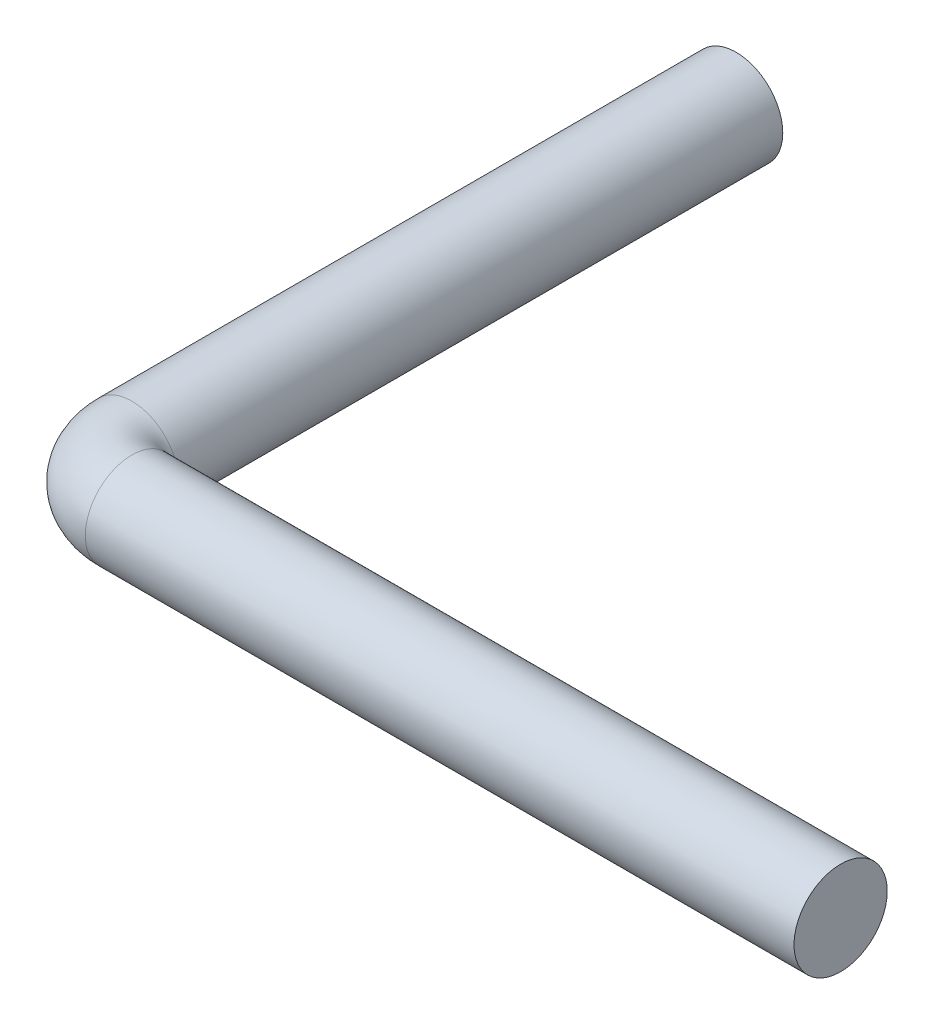
ISO-10303-21;
HEADER;
FILE_DESCRIPTION(('STEP AP214'),'2;1');
FILE_NAME('part.step','',(''),(''),'','','');
FILE_SCHEMA(('AUTOMOTIVE_DESIGN { 1 0 10303 214 1 1 1 1 }'));
ENDSEC;
DATA;
#1=APPLICATION_CONTEXT('core data for automotive mechanical design processes');
#2=APPLICATION_PROTOCOL_DEFINITION('international standard','automotive_design',2000,#1);
#3=PRODUCT_CONTEXT('',#1,'mechanical');
#4=PRODUCT('Part','Part','',(#3));
#5=PRODUCT_RELATED_PRODUCT_CATEGORY('part','',(#4));
#6=PRODUCT_DEFINITION_FORMATION('','',#4);
#7=PRODUCT_DEFINITION_CONTEXT('part definition',#1,'design');
#8=PRODUCT_DEFINITION('design','',#6,#7);
#9=PRODUCT_DEFINITION_SHAPE('','',#8);
#10=(LENGTH_UNIT() NAMED_UNIT(*) SI_UNIT(.MILLI.,.METRE.));
#11=(NAMED_UNIT(*) PLANE_ANGLE_UNIT() SI_UNIT($,.RADIAN.));
#12=(NAMED_UNIT(*) SI_UNIT($,.STERADIAN.) SOLID_ANGLE_UNIT());
#13=UNCERTAINTY_MEASURE_WITH_UNIT(LENGTH_MEASURE(1.E-05),#10,'distance_accuracy_value','');
#14=(GEOMETRIC_REPRESENTATION_CONTEXT(3) GLOBAL_UNCERTAINTY_ASSIGNED_CONTEXT((#13)) GLOBAL_UNIT_ASSIGNED_CONTEXT((#10,
#11,#12)) REPRESENTATION_CONTEXT('',''));
#15=CARTESIAN_POINT('',(0.,0.,0.));
#16=DIRECTION('',(0.,0.,1.));
#17=DIRECTION('',(1.,0.,0.));
#18=AXIS2_PLACEMENT_3D('',#15,#16,#17);
#19=CARTESIAN_POINT('',(0.,0.,-2.7));
#20=DIRECTION('',(0.,0.,-1.));
#21=DIRECTION('',(0.,-1.,0.));
#22=AXIS2_PLACEMENT_3D('',#19,#20,#21);
#23=PLANE('',#22);
#24=CARTESIAN_POINT('',(0.,0.,-2.7));
#25=DIRECTION('',(0.,0.,-1.));
#26=DIRECTION('',(1.,0.,0.));
#27=AXIS2_PLACEMENT_3D('',#24,#25,#26);
#28=CIRCLE('',#27,0.29);
#29=CARTESIAN_POINT('',(0.29,0.,-2.7));
#30=VERTEX_POINT('',#29);
#31=EDGE_CURVE('E11',#30,#30,#28,.T.);
#32=ORIENTED_EDGE('',*,*,#31,.T.);
#33=EDGE_LOOP('',(#32));
#34=FACE_BOUND('',#33,.T.);
#35=ADVANCED_FACE('F16',(#34),#23,.T.);
#36=CARTESIAN_POINT('',(4.7,0.,1.35));
#37=DIRECTION('',(-1.,0.,0.));
#38=DIRECTION('',(0.,1.,0.));
#39=AXIS2_PLACEMENT_3D('',#36,#37,#38);
#40=PLANE('',#39);
#41=CARTESIAN_POINT('',(4.7,0.,1.35));
#42=DIRECTION('',(-1.,0.,0.));
#43=DIRECTION('',(0.,0.,-1.));
#44=AXIS2_PLACEMENT_3D('',#41,#42,#43);
#45=CIRCLE('',#44,0.29);
#46=CARTESIAN_POINT('',(4.7,0.,1.06));
#47=VERTEX_POINT('',#46);
#48=EDGE_CURVE('E54',#47,#47,#45,.T.);
#49=ORIENTED_EDGE('',*,*,#48,.F.);
#50=EDGE_LOOP('',(#49));
#51=FACE_BOUND('',#50,.T.);
#52=ADVANCED_FACE('F97',(#51),#40,.F.);
#53=CARTESIAN_POINT('',(0.,0.,1.06));
#54=DIRECTION('',(0.,0.,-1.));
#55=DIRECTION('',(1.,0.,0.));
#56=AXIS2_PLACEMENT_3D('',#53,#54,#55);
#57=CYLINDRICAL_SURFACE('',#56,0.29);
#58=DIRECTION('',(0.,0.,-1.));
#59=VECTOR('',#58,1.);
#60=CARTESIAN_POINT('',(0.29,0.,1.06));
#61=LINE('',#60,#59);
#62=CARTESIAN_POINT('',(0.29,0.,1.06));
#63=VERTEX_POINT('',#62);
#64=EDGE_CURVE('E28',#63,#30,#61,.T.);
#65=ORIENTED_EDGE('',*,*,#64,.T.);
#66=ORIENTED_EDGE('',*,*,#31,.F.);
#67=ORIENTED_EDGE('',*,*,#64,.F.);
#68=CARTESIAN_POINT('',(0.,0.,1.06));
#69=DIRECTION('',(0.,0.,1.));
#70=DIRECTION('',(-1.,0.,0.));
#71=AXIS2_PLACEMENT_3D('',#68,#69,#70);
#72=CIRCLE('',#71,0.29);
#73=EDGE_CURVE('E60',#63,#63,#72,.T.);
#74=ORIENTED_EDGE('',*,*,#73,.F.);
#75=EDGE_LOOP('',(#65,#66,#67,#74));
#76=FACE_BOUND('',#75,.T.);
#77=ADVANCED_FACE('F92',(#76),#57,.T.);
#78=CARTESIAN_POINT('',(0.29,0.,1.06));
#79=CARTESIAN_POINT('',(0.29,0.58,1.06));
#80=CARTESIAN_POINT('',(0.869999999999999,0.58,1.06));
#81=CARTESIAN_POINT('',(0.87,0.,1.06));
#82=CARTESIAN_POINT('',(0.869999999999999,-0.58,1.06));
#83=CARTESIAN_POINT('',(0.29,-0.58,1.06));
#84=CARTESIAN_POINT('',(0.29,0.,1.06));
#85=(BOUNDED_CURVE() B_SPLINE_CURVE(3,(#78,#79,#80,#81,#82,#83,#84),.UNSPECIFIED.,.T.,
.F.) B_SPLINE_CURVE_WITH_KNOTS((4,3,4),(0.,0.5,1.),
.UNSPECIFIED.) CURVE() GEOMETRIC_REPRESENTATION_ITEM() RATIONAL_B_SPLINE_CURVE((1.,
0.333333333333334,0.333333333333334,1.,0.333333333333334,0.333333333333334,1.)) REPRESENTATION_ITEM(''));
#86=CARTESIAN_POINT('',(0.29,0.,1.06));
#87=DIRECTION('',(0.,1.,0.));
#88=AXIS1_PLACEMENT('',#86,#87);
#89=SURFACE_OF_REVOLUTION('',#85,#88);
#90=CARTESIAN_POINT('',(0.29,0.,1.35));
#91=DIRECTION('',(-1.,0.,0.));
#92=DIRECTION('',(0.,0.,-1.));
#93=AXIS2_PLACEMENT_3D('',#90,#91,#92);
#94=CIRCLE('',#93,0.29);
#95=EDGE_CURVE('E61',#63,#63,#94,.T.);
#96=ORIENTED_EDGE('',*,*,#95,.T.);
#97=ORIENTED_EDGE('',*,*,#73,.T.);
#98=EDGE_LOOP('',(#96,#97));
#99=FACE_BOUND('',#98,.T.);
#100=ADVANCED_FACE('F18',(#99),#89,.F.);
#101=CARTESIAN_POINT('',(4.7,0.,1.35));
#102=DIRECTION('',(-1.,0.,0.));
#103=DIRECTION('',(0.,0.,-1.));
#104=AXIS2_PLACEMENT_3D('',#101,#102,#103);
#105=CYLINDRICAL_SURFACE('',#104,0.29);
#106=DIRECTION('',(-1.,0.,0.));
#107=VECTOR('',#106,1.);
#108=CARTESIAN_POINT('',(4.7,0.,1.06));
#109=LINE('',#108,#107);
#110=EDGE_CURVE('E57',#47,#63,#109,.T.);
#111=ORIENTED_EDGE('',*,*,#110,.T.);
#112=ORIENTED_EDGE('',*,*,#95,.F.);
#113=ORIENTED_EDGE('',*,*,#110,.F.);
#114=ORIENTED_EDGE('',*,*,#48,.T.);
#115=EDGE_LOOP('',(#111,#112,#113,#114));
#116=FACE_BOUND('',#115,.T.);
#117=ADVANCED_FACE('F55',(#116),#105,.T.);
#118=CLOSED_SHELL('',(#35,#52,#77,#100,#117));
#119=MANIFOLD_SOLID_BREP('B1',#118);
#120=ADVANCED_BREP_SHAPE_REPRESENTATION('',(#18,#119),#14);
#121=SHAPE_DEFINITION_REPRESENTATION(#9,#120);
ENDSEC;
END-ISO-10303-21;
